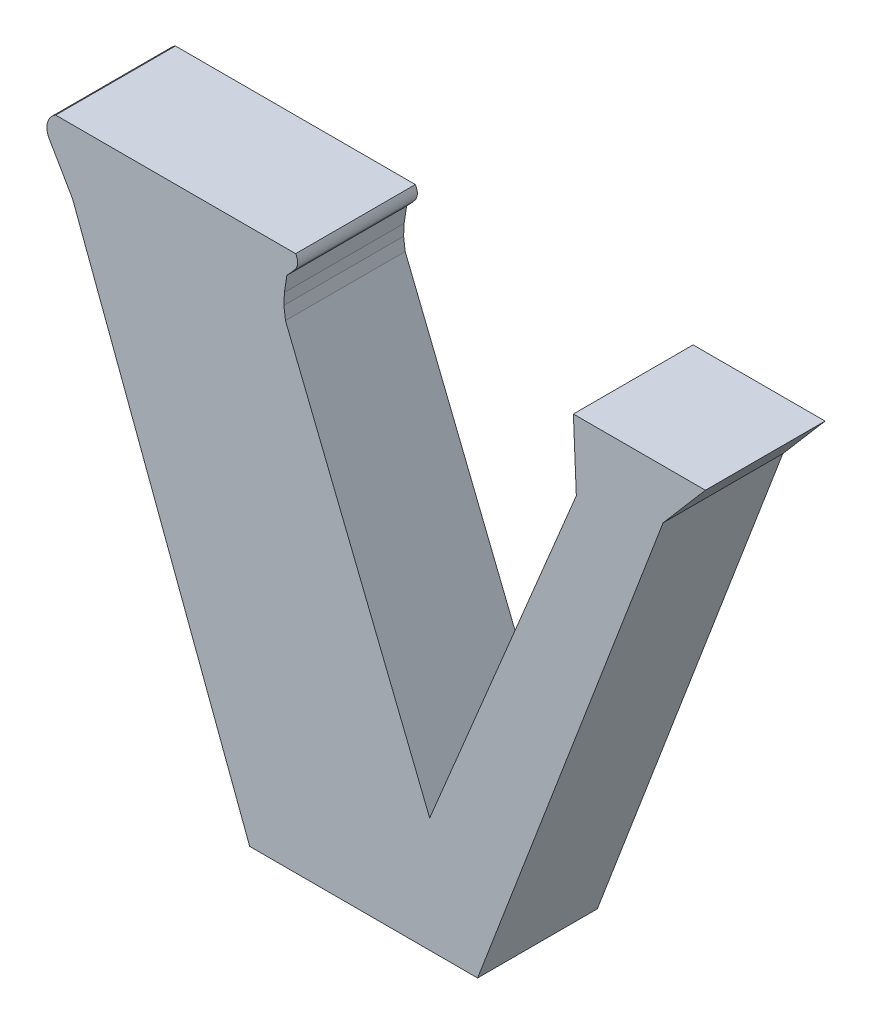
ISO-10303-21;
HEADER;
FILE_DESCRIPTION(('STEP AP214'),'2;1');
FILE_NAME('part.step','',(''),(''),'','','');
FILE_SCHEMA(('AUTOMOTIVE_DESIGN { 1 0 10303 214 1 1 1 1 }'));
ENDSEC;
DATA;
#1=APPLICATION_CONTEXT('core data for automotive mechanical design processes');
#2=APPLICATION_PROTOCOL_DEFINITION('international standard','automotive_design',2000,#1);
#3=PRODUCT_CONTEXT('',#1,'mechanical');
#4=PRODUCT('Part','Part','',(#3));
#5=PRODUCT_RELATED_PRODUCT_CATEGORY('part','',(#4));
#6=PRODUCT_DEFINITION_FORMATION('','',#4);
#7=PRODUCT_DEFINITION_CONTEXT('part definition',#1,'design');
#8=PRODUCT_DEFINITION('design','',#6,#7);
#9=PRODUCT_DEFINITION_SHAPE('','',#8);
#10=(LENGTH_UNIT() NAMED_UNIT(*) SI_UNIT(.MILLI.,.METRE.));
#11=(NAMED_UNIT(*) PLANE_ANGLE_UNIT() SI_UNIT($,.RADIAN.));
#12=(NAMED_UNIT(*) SI_UNIT($,.STERADIAN.) SOLID_ANGLE_UNIT());
#13=UNCERTAINTY_MEASURE_WITH_UNIT(LENGTH_MEASURE(1.E-05),#10,'distance_accuracy_value','');
#14=(GEOMETRIC_REPRESENTATION_CONTEXT(3) GLOBAL_UNCERTAINTY_ASSIGNED_CONTEXT((#13)) GLOBAL_UNIT_ASSIGNED_CONTEXT((#10,
#11,#12)) REPRESENTATION_CONTEXT('',''));
#15=CARTESIAN_POINT('',(0.,0.,0.));
#16=DIRECTION('',(0.,0.,1.));
#17=DIRECTION('',(1.,0.,0.));
#18=AXIS2_PLACEMENT_3D('',#15,#16,#17);
#19=CARTESIAN_POINT('',(-8.54756323357799,-16.7803014607889,69.4720552155059));
#20=DIRECTION('',(0.,0.,1.));
#21=DIRECTION('',(1.,0.,0.));
#22=AXIS2_PLACEMENT_3D('',#19,#20,#21);
#23=PLANE('',#22);
#24=DIRECTION('',(0.351178794434307,-0.936308418385559,0.));
#25=VECTOR('',#24,1.);
#26=CARTESIAN_POINT('',(-9.2317521618972,-16.9650360195179,69.4720552155059));
#27=LINE('',#26,#25);
#28=CARTESIAN_POINT('',(-9.2317521618972,-16.9650360195179,69.4720552155059));
#29=VERTEX_POINT('',#28);
#30=CARTESIAN_POINT('',(-8.66214934786214,-18.4837037704458,69.4720552155059));
#31=VERTEX_POINT('',#30);
#32=EDGE_CURVE('E228',#29,#31,#27,.T.);
#33=ORIENTED_EDGE('',*,*,#32,.F.);
#34=DIRECTION('',(0.500336982862697,-0.865830759201735,0.));
#35=VECTOR('',#34,1.);
#36=CARTESIAN_POINT('',(-9.30467604719907,-16.8388415842922,69.4720552155059));
#37=LINE('',#36,#35);
#38=CARTESIAN_POINT('',(-9.30467604720062,-16.8388415842929,69.4720552155059));
#39=VERTEX_POINT('',#38);
#40=EDGE_CURVE('E25',#39,#29,#37,.T.);
#41=ORIENTED_EDGE('',*,*,#40,.F.);
#42=CARTESIAN_POINT('',(-9.25850865605229,-16.8075080626377,69.4720552155059));
#43=DIRECTION('',(0.,0.,1.));
#44=DIRECTION('',(1.,0.,0.));
#45=AXIS2_PLACEMENT_3D('',#42,#43,#44);
#46=CIRCLE('',#45,0.0557962147888155);
#47=CARTESIAN_POINT('',(-9.3143048708411,-16.8075080626377,69.4720552155059));
#48=VERTEX_POINT('',#47);
#49=EDGE_CURVE('E196',#48,#39,#46,.T.);
#50=ORIENTED_EDGE('',*,*,#49,.F.);
#51=CARTESIAN_POINT('',(-9.25850865605229,-16.8075080626377,69.4720552155059));
#52=DIRECTION('',(0.,0.,1.));
#53=DIRECTION('',(1.,0.,0.));
#54=AXIS2_PLACEMENT_3D('',#51,#52,#53);
#55=CIRCLE('',#54,0.0557962147888155);
#56=CARTESIAN_POINT('',(-9.28589114654952,-16.7588930773041,69.4720552155059));
#57=VERTEX_POINT('',#56);
#58=EDGE_CURVE('E46',#57,#48,#55,.T.);
#59=ORIENTED_EDGE('',*,*,#58,.F.);
#60=DIRECTION('',(-1.,0.,0.));
#61=VECTOR('',#60,1.);
#62=CARTESIAN_POINT('',(-8.51428887424171,-16.7588930773041,69.4720552155059));
#63=LINE('',#62,#61);
#64=CARTESIAN_POINT('',(-8.51428887423937,-16.7588930773045,69.4720552155059));
#65=VERTEX_POINT('',#64);
#66=EDGE_CURVE('E280',#65,#57,#63,.T.);
#67=ORIENTED_EDGE('',*,*,#66,.F.);
#68=CARTESIAN_POINT('',(-8.54756323357799,-16.7803014607889,69.4720552155059));
#69=DIRECTION('',(0.,0.,1.));
#70=DIRECTION('',(1.,0.,0.));
#71=AXIS2_PLACEMENT_3D('',#68,#69,#70);
#72=CIRCLE('',#71,0.0395664235535043);
#73=CARTESIAN_POINT('',(-8.51428887424171,-16.8017098442733,69.4720552155059));
#74=VERTEX_POINT('',#73);
#75=EDGE_CURVE('E253',#74,#65,#72,.T.);
#76=ORIENTED_EDGE('',*,*,#75,.F.);
#77=DIRECTION('',(0.655192979641865,0.755461553904641,0.));
#78=VECTOR('',#77,1.);
#79=CARTESIAN_POINT('',(-8.52901619115305,-16.8186909812274,69.4720552155059));
#80=LINE('',#79,#78);
#81=CARTESIAN_POINT('',(-8.52901619115305,-16.8186909812274,69.4720552155059));
#82=VERTEX_POINT('',#81);
#83=EDGE_CURVE('E218',#82,#74,#80,.T.);
#84=ORIENTED_EDGE('',*,*,#83,.F.);
#85=DIRECTION('',(0.678534277173213,0.734568740623385,0.));
#86=VECTOR('',#85,1.);
#87=CARTESIAN_POINT('',(-8.54261053361738,-16.8334079665877,69.4720552155059));
#88=LINE('',#87,#86);
#89=CARTESIAN_POINT('',(-8.54261053361738,-16.8334079665877,69.4720552155059));
#90=VERTEX_POINT('',#89);
#91=EDGE_CURVE('E266',#90,#82,#88,.T.);
#92=ORIENTED_EDGE('',*,*,#91,.F.);
#93=DIRECTION('',(0.149058888682834,0.988828320642486,0.));
#94=VECTOR('',#93,1.);
#95=CARTESIAN_POINT('',(-8.5503797293788,-16.8849473337828,69.4720552155059));
#96=LINE('',#95,#94);
#97=CARTESIAN_POINT('',(-8.5503797293788,-16.8849473337828,69.4720552155059));
#98=VERTEX_POINT('',#97);
#99=EDGE_CURVE('E359',#98,#90,#96,.T.);
#100=ORIENTED_EDGE('',*,*,#99,.F.);
#101=DIRECTION('',(0.0475988154380199,0.998866534011876,0.));
#102=VECTOR('',#101,1.);
#103=CARTESIAN_POINT('',(-8.55214397631798,-16.9219702556573,69.4720552155059));
#104=LINE('',#103,#102);
#105=CARTESIAN_POINT('',(-8.55214397631798,-16.9219702556573,69.4720552155059));
#106=VERTEX_POINT('',#105);
#107=EDGE_CURVE('E347',#106,#98,#104,.T.);
#108=ORIENTED_EDGE('',*,*,#107,.F.);
#109=DIRECTION('',(-0.126886204003881,0.991917280438992,0.));
#110=VECTOR('',#109,1.);
#111=CARTESIAN_POINT('',(-8.54705339007427,-16.9617652869797,69.4720552155059));
#112=LINE('',#111,#110);
#113=CARTESIAN_POINT('',(-8.54705339007427,-16.9617652869797,69.4720552155059));
#114=VERTEX_POINT('',#113);
#115=EDGE_CURVE('E335',#114,#106,#112,.T.);
#116=ORIENTED_EDGE('',*,*,#115,.F.);
#117=DIRECTION('',(-0.373019319199074,0.927823575635077,0.));
#118=VECTOR('',#117,1.);
#119=CARTESIAN_POINT('',(-8.08328709285868,-18.1153068919172,69.4720552155059));
#120=LINE('',#119,#118);
#121=CARTESIAN_POINT('',(-8.08328709285868,-18.1153068919172,69.4720552155059));
#122=VERTEX_POINT('',#121);
#123=EDGE_CURVE('E323',#122,#114,#120,.T.);
#124=ORIENTED_EDGE('',*,*,#123,.F.);
#125=DIRECTION('',(-0.384147707730565,-0.923271649432253,0.));
#126=VECTOR('',#125,1.);
#127=CARTESIAN_POINT('',(-7.61164438181441,-16.9817472350314,69.4720552155059));
#128=LINE('',#127,#126);
#129=CARTESIAN_POINT('',(-7.61164438181441,-16.9817472350314,69.4720552155059));
#130=VERTEX_POINT('',#129);
#131=EDGE_CURVE('E311',#130,#122,#128,.T.);
#132=ORIENTED_EDGE('',*,*,#131,.F.);
#133=DIRECTION('',(0.0425885629400182,-0.999092695552672,0.));
#134=VECTOR('',#133,1.);
#135=CARTESIAN_POINT('',(-7.62114403921863,-16.7588930773041,69.4720552155059));
#136=LINE('',#135,#134);
#137=CARTESIAN_POINT('',(-7.62114403921863,-16.7588930773041,69.4720552155059));
#138=VERTEX_POINT('',#137);
#139=EDGE_CURVE('E296',#138,#130,#136,.T.);
#140=ORIENTED_EDGE('',*,*,#139,.F.);
#141=DIRECTION('',(-1.,0.,0.));
#142=VECTOR('',#141,1.);
#143=CARTESIAN_POINT('',(-7.19660040743437,-16.7588930773041,69.4720552155059));
#144=LINE('',#143,#142);
#145=CARTESIAN_POINT('',(-7.19660040743437,-16.7588930773041,69.4720552155059));
#146=VERTEX_POINT('',#145);
#147=EDGE_CURVE('E284',#146,#138,#144,.T.);
#148=ORIENTED_EDGE('',*,*,#147,.F.);
#149=DIRECTION('',(0.650442835926794,0.759555210100958,0.));
#150=VECTOR('',#149,1.);
#151=CARTESIAN_POINT('',(-7.33260916998033,-16.9177174328126,69.4720552155059));
#152=LINE('',#151,#150);
#153=CARTESIAN_POINT('',(-7.33260916998033,-16.9177174328126,69.4720552155059));
#154=VERTEX_POINT('',#153);
#155=EDGE_CURVE('E223',#154,#146,#152,.T.);
#156=ORIENTED_EDGE('',*,*,#155,.F.);
#157=DIRECTION('',(0.355999055886694,0.934486314617706,0.));
#158=VECTOR('',#157,1.);
#159=CARTESIAN_POINT('',(-7.92918254832558,-18.4837037704458,69.4720552155059));
#160=LINE('',#159,#158);
#161=CARTESIAN_POINT('',(-7.92918254832558,-18.4837037704458,69.4720552155059));
#162=VERTEX_POINT('',#161);
#163=EDGE_CURVE('E212',#162,#154,#160,.T.);
#164=ORIENTED_EDGE('',*,*,#163,.F.);
#165=DIRECTION('',(1.,0.,0.));
#166=VECTOR('',#165,1.);
#167=CARTESIAN_POINT('',(-8.66214934786214,-18.4837037704458,69.4720552155059));
#168=LINE('',#167,#166);
#169=EDGE_CURVE('E248',#31,#162,#168,.T.);
#170=ORIENTED_EDGE('',*,*,#169,.F.);
#171=EDGE_LOOP('',(#33,#41,#50,#59,#67,#76,#84,#92,#100,#108,#116,#124,#132,#140,#148,#156,#164,#170));
#172=FACE_BOUND('',#171,.T.);
#173=ADVANCED_FACE('F17',(#172),#23,.F.);
#174=CARTESIAN_POINT('',(-8.54756323357799,-16.7803014607889,69.8570552155059));
#175=DIRECTION('',(0.,0.,1.));
#176=DIRECTION('',(1.,0.,0.));
#177=AXIS2_PLACEMENT_3D('',#174,#175,#176);
#178=PLANE('',#177);
#179=DIRECTION('',(0.351178794434307,-0.936308418385559,0.));
#180=VECTOR('',#179,1.);
#181=CARTESIAN_POINT('',(-9.2317521618972,-16.9650360195179,69.8570552155059));
#182=LINE('',#181,#180);
#183=CARTESIAN_POINT('',(-9.2317521618972,-16.9650360195179,69.8570552155059));
#184=VERTEX_POINT('',#183);
#185=CARTESIAN_POINT('',(-8.66214934786214,-18.4837037704458,69.8570552155059));
#186=VERTEX_POINT('',#185);
#187=EDGE_CURVE('E241',#184,#186,#182,.T.);
#188=ORIENTED_EDGE('',*,*,#187,.T.);
#189=DIRECTION('',(1.,0.,0.));
#190=VECTOR('',#189,1.);
#191=CARTESIAN_POINT('',(-8.66214934786214,-18.4837037704458,69.8570552155059));
#192=LINE('',#191,#190);
#193=CARTESIAN_POINT('',(-7.92918254832558,-18.4837037704458,69.8570552155059));
#194=VERTEX_POINT('',#193);
#195=EDGE_CURVE('E262',#186,#194,#192,.T.);
#196=ORIENTED_EDGE('',*,*,#195,.T.);
#197=DIRECTION('',(0.355999055886694,0.934486314617706,0.));
#198=VECTOR('',#197,1.);
#199=CARTESIAN_POINT('',(-7.92918254832558,-18.4837037704458,69.8570552155059));
#200=LINE('',#199,#198);
#201=CARTESIAN_POINT('',(-7.33260916998033,-16.9177174328126,69.8570552155059));
#202=VERTEX_POINT('',#201);
#203=EDGE_CURVE('E211',#194,#202,#200,.T.);
#204=ORIENTED_EDGE('',*,*,#203,.T.);
#205=DIRECTION('',(0.650442835926794,0.759555210100958,0.));
#206=VECTOR('',#205,1.);
#207=CARTESIAN_POINT('',(-7.33260916998033,-16.9177174328126,69.8570552155059));
#208=LINE('',#207,#206);
#209=CARTESIAN_POINT('',(-7.19660040743437,-16.7588930773041,69.8570552155059));
#210=VERTEX_POINT('',#209);
#211=EDGE_CURVE('E233',#202,#210,#208,.T.);
#212=ORIENTED_EDGE('',*,*,#211,.T.);
#213=DIRECTION('',(-1.,0.,0.));
#214=VECTOR('',#213,1.);
#215=CARTESIAN_POINT('',(-7.19660040743437,-16.7588930773041,69.8570552155059));
#216=LINE('',#215,#214);
#217=CARTESIAN_POINT('',(-7.62114403921863,-16.7588930773041,69.8570552155059));
#218=VERTEX_POINT('',#217);
#219=EDGE_CURVE('E292',#210,#218,#216,.T.);
#220=ORIENTED_EDGE('',*,*,#219,.T.);
#221=DIRECTION('',(0.0425885629400182,-0.999092695552672,0.));
#222=VECTOR('',#221,1.);
#223=CARTESIAN_POINT('',(-7.62114403921863,-16.7588930773041,69.8570552155059));
#224=LINE('',#223,#222);
#225=CARTESIAN_POINT('',(-7.61164438181441,-16.9817472350314,69.8570552155059));
#226=VERTEX_POINT('',#225);
#227=EDGE_CURVE('E307',#218,#226,#224,.T.);
#228=ORIENTED_EDGE('',*,*,#227,.T.);
#229=DIRECTION('',(-0.384147707730565,-0.923271649432253,0.));
#230=VECTOR('',#229,1.);
#231=CARTESIAN_POINT('',(-7.61164438181441,-16.9817472350314,69.8570552155059));
#232=LINE('',#231,#230);
#233=CARTESIAN_POINT('',(-8.08328709285868,-18.1153068919172,69.8570552155059));
#234=VERTEX_POINT('',#233);
#235=EDGE_CURVE('E318',#226,#234,#232,.T.);
#236=ORIENTED_EDGE('',*,*,#235,.T.);
#237=DIRECTION('',(-0.373019319199075,0.927823575635077,0.));
#238=VECTOR('',#237,1.);
#239=CARTESIAN_POINT('',(-8.08328709285868,-18.1153068919172,69.8570552155059));
#240=LINE('',#239,#238);
#241=CARTESIAN_POINT('',(-8.54705339007427,-16.9617652869797,69.8570552155059));
#242=VERTEX_POINT('',#241);
#243=EDGE_CURVE('E331',#234,#242,#240,.T.);
#244=ORIENTED_EDGE('',*,*,#243,.T.);
#245=DIRECTION('',(-0.126886204003881,0.991917280438992,0.));
#246=VECTOR('',#245,1.);
#247=CARTESIAN_POINT('',(-8.54705339007427,-16.9617652869797,69.8570552155059));
#248=LINE('',#247,#246);
#249=CARTESIAN_POINT('',(-8.55214397631798,-16.9219702556573,69.8570552155059));
#250=VERTEX_POINT('',#249);
#251=EDGE_CURVE('E343',#242,#250,#248,.T.);
#252=ORIENTED_EDGE('',*,*,#251,.T.);
#253=DIRECTION('',(0.0475988154380199,0.998866534011876,0.));
#254=VECTOR('',#253,1.);
#255=CARTESIAN_POINT('',(-8.55214397631798,-16.9219702556573,69.8570552155059));
#256=LINE('',#255,#254);
#257=CARTESIAN_POINT('',(-8.5503797293788,-16.8849473337828,69.8570552155059));
#258=VERTEX_POINT('',#257);
#259=EDGE_CURVE('E355',#250,#258,#256,.T.);
#260=ORIENTED_EDGE('',*,*,#259,.T.);
#261=DIRECTION('',(0.149058888682834,0.988828320642486,0.));
#262=VECTOR('',#261,1.);
#263=CARTESIAN_POINT('',(-8.5503797293788,-16.8849473337828,69.8570552155059));
#264=LINE('',#263,#262);
#265=CARTESIAN_POINT('',(-8.54261053361738,-16.8334079665877,69.8570552155059));
#266=VERTEX_POINT('',#265);
#267=EDGE_CURVE('E270',#258,#266,#264,.T.);
#268=ORIENTED_EDGE('',*,*,#267,.T.);
#269=DIRECTION('',(0.678534277173213,0.734568740623385,0.));
#270=VECTOR('',#269,1.);
#271=CARTESIAN_POINT('',(-8.54261053361738,-16.8334079665877,69.8570552155059));
#272=LINE('',#271,#270);
#273=CARTESIAN_POINT('',(-8.52901619115305,-16.8186909812274,69.8570552155059));
#274=VERTEX_POINT('',#273);
#275=EDGE_CURVE('E214',#266,#274,#272,.T.);
#276=ORIENTED_EDGE('',*,*,#275,.T.);
#277=DIRECTION('',(0.655192979641865,0.755461553904641,0.));
#278=VECTOR('',#277,1.);
#279=CARTESIAN_POINT('',(-8.52901619115305,-16.8186909812274,69.8570552155059));
#280=LINE('',#279,#278);
#281=CARTESIAN_POINT('',(-8.51428887424171,-16.8017098442733,69.8570552155059));
#282=VERTEX_POINT('',#281);
#283=EDGE_CURVE('E249',#274,#282,#280,.T.);
#284=ORIENTED_EDGE('',*,*,#283,.T.);
#285=CARTESIAN_POINT('',(-8.54756323357799,-16.7803014607889,69.8570552155059));
#286=DIRECTION('',(0.,0.,1.));
#287=DIRECTION('',(0.,-1.,0.));
#288=AXIS2_PLACEMENT_3D('',#285,#286,#287);
#289=CIRCLE('',#288,0.0395664235535026);
#290=CARTESIAN_POINT('',(-8.51428887423937,-16.7588930773045,69.8570552155059));
#291=VERTEX_POINT('',#290);
#292=EDGE_CURVE('E383',#282,#291,#289,.T.);
#293=ORIENTED_EDGE('',*,*,#292,.T.);
#294=DIRECTION('',(-1.,0.,0.));
#295=VECTOR('',#294,1.);
#296=CARTESIAN_POINT('',(-8.51428887424171,-16.7588930773041,69.8570552155059));
#297=LINE('',#296,#295);
#298=CARTESIAN_POINT('',(-9.28589114654952,-16.7588930773041,69.8570552155059));
#299=VERTEX_POINT('',#298);
#300=EDGE_CURVE('E186',#291,#299,#297,.T.);
#301=ORIENTED_EDGE('',*,*,#300,.T.);
#302=CARTESIAN_POINT('',(-9.25850865605229,-16.8075080626377,69.8570552155059));
#303=DIRECTION('',(0.,0.,1.));
#304=DIRECTION('',(0.,-1.,0.));
#305=AXIS2_PLACEMENT_3D('',#302,#303,#304);
#306=CIRCLE('',#305,0.0557962147888155);
#307=CARTESIAN_POINT('',(-9.3143048708411,-16.8075080626377,69.8570552155059));
#308=VERTEX_POINT('',#307);
#309=EDGE_CURVE('E36',#299,#308,#306,.T.);
#310=ORIENTED_EDGE('',*,*,#309,.T.);
#311=CARTESIAN_POINT('',(-9.25850865605229,-16.8075080626377,69.8570552155059));
#312=DIRECTION('',(0.,0.,1.));
#313=DIRECTION('',(0.,-1.,0.));
#314=AXIS2_PLACEMENT_3D('',#311,#312,#313);
#315=CIRCLE('',#314,0.0557962147888155);
#316=CARTESIAN_POINT('',(-9.30467604720062,-16.8388415842929,69.8570552155059));
#317=VERTEX_POINT('',#316);
#318=EDGE_CURVE('E184',#308,#317,#315,.T.);
#319=ORIENTED_EDGE('',*,*,#318,.T.);
#320=DIRECTION('',(0.500336982862697,-0.865830759201735,0.));
#321=VECTOR('',#320,1.);
#322=CARTESIAN_POINT('',(-9.30467604719907,-16.8388415842922,69.8570552155059));
#323=LINE('',#322,#321);
#324=EDGE_CURVE('E11',#317,#184,#323,.T.);
#325=ORIENTED_EDGE('',*,*,#324,.T.);
#326=EDGE_LOOP('',(#188,#196,#204,#212,#220,#228,#236,#244,#252,#260,#268,#276,#284,#293,#301,
#310,#319,#325));
#327=FACE_BOUND('',#326,.T.);
#328=ADVANCED_FACE('F182',(#327),#178,.T.);
#329=CARTESIAN_POINT('',(-9.30467604719907,-16.8388415842922,69.8220552155059));
#330=DIRECTION('',(0.865830759201735,0.500336982862697,0.));
#331=DIRECTION('',(0.,0.,-1.));
#332=AXIS2_PLACEMENT_3D('',#329,#330,#331);
#333=PLANE('',#332);
#334=ORIENTED_EDGE('',*,*,#40,.T.);
#335=DIRECTION('',(0.,0.,-1.));
#336=VECTOR('',#335,1.);
#337=CARTESIAN_POINT('',(-9.2317521618972,-16.9650360195179,69.8220552155059));
#338=LINE('',#337,#336);
#339=EDGE_CURVE('E244',#184,#29,#338,.T.);
#340=ORIENTED_EDGE('',*,*,#339,.F.);
#341=ORIENTED_EDGE('',*,*,#324,.F.);
#342=DIRECTION('',(0.,0.,-1.));
#343=VECTOR('',#342,1.);
#344=CARTESIAN_POINT('',(-9.30467604720062,-16.8388415842929,69.8220552155059));
#345=LINE('',#344,#343);
#346=EDGE_CURVE('E201',#317,#39,#345,.T.);
#347=ORIENTED_EDGE('',*,*,#346,.T.);
#348=EDGE_LOOP('',(#334,#340,#341,#347));
#349=FACE_BOUND('',#348,.T.);
#350=ADVANCED_FACE('F610',(#349),#333,.F.);
#351=CARTESIAN_POINT('',(-9.25850865605229,-16.8075080626377,69.8220552155059));
#352=DIRECTION('',(0.,0.,-1.));
#353=DIRECTION('',(-1.,0.,0.));
#354=AXIS2_PLACEMENT_3D('',#351,#352,#353);
#355=CYLINDRICAL_SURFACE('',#354,0.0557962147888155);
#356=DIRECTION('',(0.,0.,-1.));
#357=VECTOR('',#356,1.);
#358=CARTESIAN_POINT('',(-9.3143048708411,-16.8075080626377,69.8220552155059));
#359=LINE('',#358,#357);
#360=EDGE_CURVE('E191',#308,#48,#359,.T.);
#361=ORIENTED_EDGE('',*,*,#360,.F.);
#362=ORIENTED_EDGE('',*,*,#309,.F.);
#363=DIRECTION('',(0.,0.,-1.));
#364=VECTOR('',#363,1.);
#365=CARTESIAN_POINT('',(-9.28589114654952,-16.7588930773041,69.8220552155059));
#366=LINE('',#365,#364);
#367=EDGE_CURVE('E277',#299,#57,#366,.T.);
#368=ORIENTED_EDGE('',*,*,#367,.T.);
#369=ORIENTED_EDGE('',*,*,#58,.T.);
#370=EDGE_LOOP('',(#361,#362,#368,#369));
#371=FACE_BOUND('',#370,.T.);
#372=ADVANCED_FACE('F192',(#371),#355,.T.);
#373=CARTESIAN_POINT('',(-8.51428887424171,-16.7588930773041,69.8220552155059));
#374=DIRECTION('',(0.,-1.,0.));
#375=DIRECTION('',(0.,0.,-1.));
#376=AXIS2_PLACEMENT_3D('',#373,#374,#375);
#377=PLANE('',#376);
#378=ORIENTED_EDGE('',*,*,#66,.T.);
#379=ORIENTED_EDGE('',*,*,#367,.F.);
#380=ORIENTED_EDGE('',*,*,#300,.F.);
#381=DIRECTION('',(0.,0.,-1.));
#382=VECTOR('',#381,1.);
#383=CARTESIAN_POINT('',(-8.51428887423937,-16.7588930773045,69.8220552155059));
#384=LINE('',#383,#382);
#385=EDGE_CURVE('E379',#291,#65,#384,.T.);
#386=ORIENTED_EDGE('',*,*,#385,.T.);
#387=EDGE_LOOP('',(#378,#379,#380,#386));
#388=FACE_BOUND('',#387,.T.);
#389=ADVANCED_FACE('F397',(#388),#377,.F.);
#390=CARTESIAN_POINT('',(-8.54756323357799,-16.7803014607889,69.8220552155059));
#391=DIRECTION('',(0.,0.,-1.));
#392=DIRECTION('',(-1.,0.,0.));
#393=AXIS2_PLACEMENT_3D('',#390,#391,#392);
#394=CYLINDRICAL_SURFACE('',#393,0.0395664235535043);
#395=ORIENTED_EDGE('',*,*,#75,.T.);
#396=ORIENTED_EDGE('',*,*,#385,.F.);
#397=ORIENTED_EDGE('',*,*,#292,.F.);
#398=DIRECTION('',(0.,0.,-1.));
#399=VECTOR('',#398,1.);
#400=CARTESIAN_POINT('',(-8.51428887424171,-16.8017098442733,69.8220552155059));
#401=LINE('',#400,#399);
#402=EDGE_CURVE('E254',#282,#74,#401,.T.);
#403=ORIENTED_EDGE('',*,*,#402,.T.);
#404=EDGE_LOOP('',(#395,#396,#397,#403));
#405=FACE_BOUND('',#404,.T.);
#406=ADVANCED_FACE('F403',(#405),#394,.T.);
#407=CARTESIAN_POINT('',(-8.52901619115305,-16.8186909812274,69.8220552155059));
#408=DIRECTION('',(-0.755461553904641,0.655192979641865,0.));
#409=DIRECTION('',(0.,0.,1.));
#410=AXIS2_PLACEMENT_3D('',#407,#408,#409);
#411=PLANE('',#410);
#412=ORIENTED_EDGE('',*,*,#83,.T.);
#413=ORIENTED_EDGE('',*,*,#402,.F.);
#414=ORIENTED_EDGE('',*,*,#283,.F.);
#415=DIRECTION('',(0.,0.,-1.));
#416=VECTOR('',#415,1.);
#417=CARTESIAN_POINT('',(-8.52901619115305,-16.8186909812274,69.8220552155059));
#418=LINE('',#417,#416);
#419=EDGE_CURVE('E219',#274,#82,#418,.T.);
#420=ORIENTED_EDGE('',*,*,#419,.T.);
#421=EDGE_LOOP('',(#412,#413,#414,#420));
#422=FACE_BOUND('',#421,.T.);
#423=ADVANCED_FACE('F429',(#422),#411,.F.);
#424=CARTESIAN_POINT('',(-8.54261053361738,-16.8334079665877,69.8220552155059));
#425=DIRECTION('',(-0.734568740623385,0.678534277173213,0.));
#426=DIRECTION('',(0.,0.,1.));
#427=AXIS2_PLACEMENT_3D('',#424,#425,#426);
#428=PLANE('',#427);
#429=ORIENTED_EDGE('',*,*,#91,.T.);
#430=ORIENTED_EDGE('',*,*,#419,.F.);
#431=ORIENTED_EDGE('',*,*,#275,.F.);
#432=DIRECTION('',(0.,0.,-1.));
#433=VECTOR('',#432,1.);
#434=CARTESIAN_POINT('',(-8.54261053361738,-16.8334079665877,69.8220552155059));
#435=LINE('',#434,#433);
#436=EDGE_CURVE('E363',#266,#90,#435,.T.);
#437=ORIENTED_EDGE('',*,*,#436,.T.);
#438=EDGE_LOOP('',(#429,#430,#431,#437));
#439=FACE_BOUND('',#438,.T.);
#440=ADVANCED_FACE('F434',(#439),#428,.F.);
#441=CARTESIAN_POINT('',(-8.5503797293788,-16.8849473337828,69.8220552155059));
#442=DIRECTION('',(-0.988828320642486,0.149058888682834,0.));
#443=DIRECTION('',(0.,0.,1.));
#444=AXIS2_PLACEMENT_3D('',#441,#442,#443);
#445=PLANE('',#444);
#446=ORIENTED_EDGE('',*,*,#99,.T.);
#447=ORIENTED_EDGE('',*,*,#436,.F.);
#448=ORIENTED_EDGE('',*,*,#267,.F.);
#449=DIRECTION('',(0.,0.,-1.));
#450=VECTOR('',#449,1.);
#451=CARTESIAN_POINT('',(-8.5503797293788,-16.8849473337828,69.8220552155059));
#452=LINE('',#451,#450);
#453=EDGE_CURVE('E351',#258,#98,#452,.T.);
#454=ORIENTED_EDGE('',*,*,#453,.T.);
#455=EDGE_LOOP('',(#446,#447,#448,#454));
#456=FACE_BOUND('',#455,.T.);
#457=ADVANCED_FACE('F551',(#456),#445,.F.);
#458=CARTESIAN_POINT('',(-8.55214397631798,-16.9219702556573,69.8220552155059));
#459=DIRECTION('',(-0.998866534011876,0.0475988154380199,0.));
#460=DIRECTION('',(0.,0.,1.));
#461=AXIS2_PLACEMENT_3D('',#458,#459,#460);
#462=PLANE('',#461);
#463=ORIENTED_EDGE('',*,*,#107,.T.);
#464=ORIENTED_EDGE('',*,*,#453,.F.);
#465=ORIENTED_EDGE('',*,*,#259,.F.);
#466=DIRECTION('',(0.,0.,-1.));
#467=VECTOR('',#466,1.);
#468=CARTESIAN_POINT('',(-8.55214397631798,-16.9219702556573,69.8220552155059));
#469=LINE('',#468,#467);
#470=EDGE_CURVE('E339',#250,#106,#469,.T.);
#471=ORIENTED_EDGE('',*,*,#470,.T.);
#472=EDGE_LOOP('',(#463,#464,#465,#471));
#473=FACE_BOUND('',#472,.T.);
#474=ADVANCED_FACE('F564',(#473),#462,.F.);
#475=CARTESIAN_POINT('',(-8.54705339007427,-16.9617652869797,69.8220552155059));
#476=DIRECTION('',(-0.991917280438992,-0.126886204003881,0.));
#477=DIRECTION('',(-0.126886204003881,0.991917280438992,0.));
#478=AXIS2_PLACEMENT_3D('',#475,#476,#477);
#479=PLANE('',#478);
#480=ORIENTED_EDGE('',*,*,#115,.T.);
#481=ORIENTED_EDGE('',*,*,#470,.F.);
#482=ORIENTED_EDGE('',*,*,#251,.F.);
#483=DIRECTION('',(0.,0.,-1.));
#484=VECTOR('',#483,1.);
#485=CARTESIAN_POINT('',(-8.54705339007427,-16.9617652869797,69.8220552155059));
#486=LINE('',#485,#484);
#487=EDGE_CURVE('E327',#242,#114,#486,.T.);
#488=ORIENTED_EDGE('',*,*,#487,.T.);
#489=EDGE_LOOP('',(#480,#481,#482,#488));
#490=FACE_BOUND('',#489,.T.);
#491=ADVANCED_FACE('F450',(#490),#479,.F.);
#492=CARTESIAN_POINT('',(-8.08328709285868,-18.1153068919172,69.8220552155059));
#493=DIRECTION('',(-0.927823575635077,-0.373019319199075,0.));
#494=DIRECTION('',(-0.373019319199075,0.927823575635077,0.));
#495=AXIS2_PLACEMENT_3D('',#492,#493,#494);
#496=PLANE('',#495);
#497=ORIENTED_EDGE('',*,*,#123,.T.);
#498=ORIENTED_EDGE('',*,*,#487,.F.);
#499=ORIENTED_EDGE('',*,*,#243,.F.);
#500=DIRECTION('',(0.,0.,-1.));
#501=VECTOR('',#500,1.);
#502=CARTESIAN_POINT('',(-8.08328709285868,-18.1153068919172,69.8220552155059));
#503=LINE('',#502,#501);
#504=EDGE_CURVE('E315',#234,#122,#503,.T.);
#505=ORIENTED_EDGE('',*,*,#504,.T.);
#506=EDGE_LOOP('',(#497,#498,#499,#505));
#507=FACE_BOUND('',#506,.T.);
#508=ADVANCED_FACE('F444',(#507),#496,.F.);
#509=CARTESIAN_POINT('',(-7.61164438181441,-16.9817472350314,69.8220552155059));
#510=DIRECTION('',(0.923271649432253,-0.384147707730565,0.));
#511=DIRECTION('',(0.,0.,-1.));
#512=AXIS2_PLACEMENT_3D('',#509,#510,#511);
#513=PLANE('',#512);
#514=ORIENTED_EDGE('',*,*,#131,.T.);
#515=ORIENTED_EDGE('',*,*,#504,.F.);
#516=ORIENTED_EDGE('',*,*,#235,.F.);
#517=DIRECTION('',(0.,0.,-1.));
#518=VECTOR('',#517,1.);
#519=CARTESIAN_POINT('',(-7.61164438181441,-16.9817472350314,69.8220552155059));
#520=LINE('',#519,#518);
#521=EDGE_CURVE('E300',#226,#130,#520,.T.);
#522=ORIENTED_EDGE('',*,*,#521,.T.);
#523=EDGE_LOOP('',(#514,#515,#516,#522));
#524=FACE_BOUND('',#523,.T.);
#525=ADVANCED_FACE('F449',(#524),#513,.F.);
#526=CARTESIAN_POINT('',(-7.62114403921863,-16.7588930773041,69.8220552155059));
#527=DIRECTION('',(0.999092695552672,0.0425885629400182,0.));
#528=DIRECTION('',(0.,0.,-1.));
#529=AXIS2_PLACEMENT_3D('',#526,#527,#528);
#530=PLANE('',#529);
#531=ORIENTED_EDGE('',*,*,#139,.T.);
#532=ORIENTED_EDGE('',*,*,#521,.F.);
#533=ORIENTED_EDGE('',*,*,#227,.F.);
#534=DIRECTION('',(0.,0.,-1.));
#535=VECTOR('',#534,1.);
#536=CARTESIAN_POINT('',(-7.62114403921863,-16.7588930773041,69.8220552155059));
#537=LINE('',#536,#535);
#538=EDGE_CURVE('E288',#218,#138,#537,.T.);
#539=ORIENTED_EDGE('',*,*,#538,.T.);
#540=EDGE_LOOP('',(#531,#532,#533,#539));
#541=FACE_BOUND('',#540,.T.);
#542=ADVANCED_FACE('F516',(#541),#530,.F.);
#543=CARTESIAN_POINT('',(-7.19660040743437,-16.7588930773041,69.8220552155059));
#544=DIRECTION('',(0.,-1.,0.));
#545=DIRECTION('',(0.,0.,-1.));
#546=AXIS2_PLACEMENT_3D('',#543,#544,#545);
#547=PLANE('',#546);
#548=ORIENTED_EDGE('',*,*,#147,.T.);
#549=ORIENTED_EDGE('',*,*,#538,.F.);
#550=ORIENTED_EDGE('',*,*,#219,.F.);
#551=DIRECTION('',(0.,0.,-1.));
#552=VECTOR('',#551,1.);
#553=CARTESIAN_POINT('',(-7.19660040743437,-16.7588930773041,69.8220552155059));
#554=LINE('',#553,#552);
#555=EDGE_CURVE('E229',#210,#146,#554,.T.);
#556=ORIENTED_EDGE('',*,*,#555,.T.);
#557=EDGE_LOOP('',(#548,#549,#550,#556));
#558=FACE_BOUND('',#557,.T.);
#559=ADVANCED_FACE('F503',(#558),#547,.F.);
#560=CARTESIAN_POINT('',(-7.33260916998033,-16.9177174328126,69.8220552155059));
#561=DIRECTION('',(-0.759555210100958,0.650442835926794,0.));
#562=DIRECTION('',(0.,0.,1.));
#563=AXIS2_PLACEMENT_3D('',#560,#561,#562);
#564=PLANE('',#563);
#565=ORIENTED_EDGE('',*,*,#155,.T.);
#566=ORIENTED_EDGE('',*,*,#555,.F.);
#567=ORIENTED_EDGE('',*,*,#211,.F.);
#568=DIRECTION('',(0.,0.,-1.));
#569=VECTOR('',#568,1.);
#570=CARTESIAN_POINT('',(-7.33260916998033,-16.9177174328126,69.8220552155059));
#571=LINE('',#570,#569);
#572=EDGE_CURVE('E208',#202,#154,#571,.T.);
#573=ORIENTED_EDGE('',*,*,#572,.T.);
#574=EDGE_LOOP('',(#565,#566,#567,#573));
#575=FACE_BOUND('',#574,.T.);
#576=ADVANCED_FACE('F490',(#575),#564,.F.);
#577=CARTESIAN_POINT('',(-7.92918254832558,-18.4837037704458,69.8220552155059));
#578=DIRECTION('',(-0.934486314617707,0.355999055886693,0.));
#579=DIRECTION('',(0.,0.,1.));
#580=AXIS2_PLACEMENT_3D('',#577,#578,#579);
#581=PLANE('',#580);
#582=ORIENTED_EDGE('',*,*,#163,.T.);
#583=ORIENTED_EDGE('',*,*,#572,.F.);
#584=ORIENTED_EDGE('',*,*,#203,.F.);
#585=DIRECTION('',(0.,0.,-1.));
#586=VECTOR('',#585,1.);
#587=CARTESIAN_POINT('',(-7.92918254832558,-18.4837037704458,69.8220552155059));
#588=LINE('',#587,#586);
#589=EDGE_CURVE('E258',#194,#162,#588,.T.);
#590=ORIENTED_EDGE('',*,*,#589,.T.);
#591=EDGE_LOOP('',(#582,#583,#584,#590));
#592=FACE_BOUND('',#591,.T.);
#593=ADVANCED_FACE('F477',(#592),#581,.F.);
#594=CARTESIAN_POINT('',(-8.66214934786214,-18.4837037704458,69.8220552155059));
#595=DIRECTION('',(0.,1.,0.));
#596=DIRECTION('',(1.,0.,0.));
#597=AXIS2_PLACEMENT_3D('',#594,#595,#596);
#598=PLANE('',#597);
#599=ORIENTED_EDGE('',*,*,#169,.T.);
#600=ORIENTED_EDGE('',*,*,#589,.F.);
#601=ORIENTED_EDGE('',*,*,#195,.F.);
#602=DIRECTION('',(0.,0.,-1.));
#603=VECTOR('',#602,1.);
#604=CARTESIAN_POINT('',(-8.66214934786214,-18.4837037704458,69.8220552155059));
#605=LINE('',#604,#603);
#606=EDGE_CURVE('E237',#186,#31,#605,.T.);
#607=ORIENTED_EDGE('',*,*,#606,.T.);
#608=EDGE_LOOP('',(#599,#600,#601,#607));
#609=FACE_BOUND('',#608,.T.);
#610=ADVANCED_FACE('F464',(#609),#598,.F.);
#611=CARTESIAN_POINT('',(-9.2317521618972,-16.9650360195179,69.8220552155059));
#612=DIRECTION('',(0.936308418385559,0.351178794434307,0.));
#613=DIRECTION('',(0.,0.,-1.));
#614=AXIS2_PLACEMENT_3D('',#611,#612,#613);
#615=PLANE('',#614);
#616=ORIENTED_EDGE('',*,*,#32,.T.);
#617=ORIENTED_EDGE('',*,*,#606,.F.);
#618=ORIENTED_EDGE('',*,*,#187,.F.);
#619=ORIENTED_EDGE('',*,*,#339,.T.);
#620=EDGE_LOOP('',(#616,#617,#618,#619));
#621=FACE_BOUND('',#620,.T.);
#622=ADVANCED_FACE('F420',(#621),#615,.F.);
#623=CARTESIAN_POINT('',(-9.25850865605229,-16.8075080626377,69.8220552155059));
#624=DIRECTION('',(0.,0.,-1.));
#625=DIRECTION('',(-1.,0.,0.));
#626=AXIS2_PLACEMENT_3D('',#623,#624,#625);
#627=CYLINDRICAL_SURFACE('',#626,0.0557962147888155);
#628=ORIENTED_EDGE('',*,*,#318,.F.);
#629=ORIENTED_EDGE('',*,*,#360,.T.);
#630=ORIENTED_EDGE('',*,*,#49,.T.);
#631=ORIENTED_EDGE('',*,*,#346,.F.);
#632=EDGE_LOOP('',(#628,#629,#630,#631));
#633=FACE_BOUND('',#632,.T.);
#634=ADVANCED_FACE('F199',(#633),#627,.T.);
#635=CLOSED_SHELL('',(#173,#328,#350,#372,#389,#406,#423,#440,#457,#474,#491,#508,#525,#542,
#559,#576,#593,#610,#622,#634));
#636=MANIFOLD_SOLID_BREP('B1',#635);
#637=ADVANCED_BREP_SHAPE_REPRESENTATION('',(#18,#636),#14);
#638=SHAPE_DEFINITION_REPRESENTATION(#9,#637);
ENDSEC;
END-ISO-10303-21;
